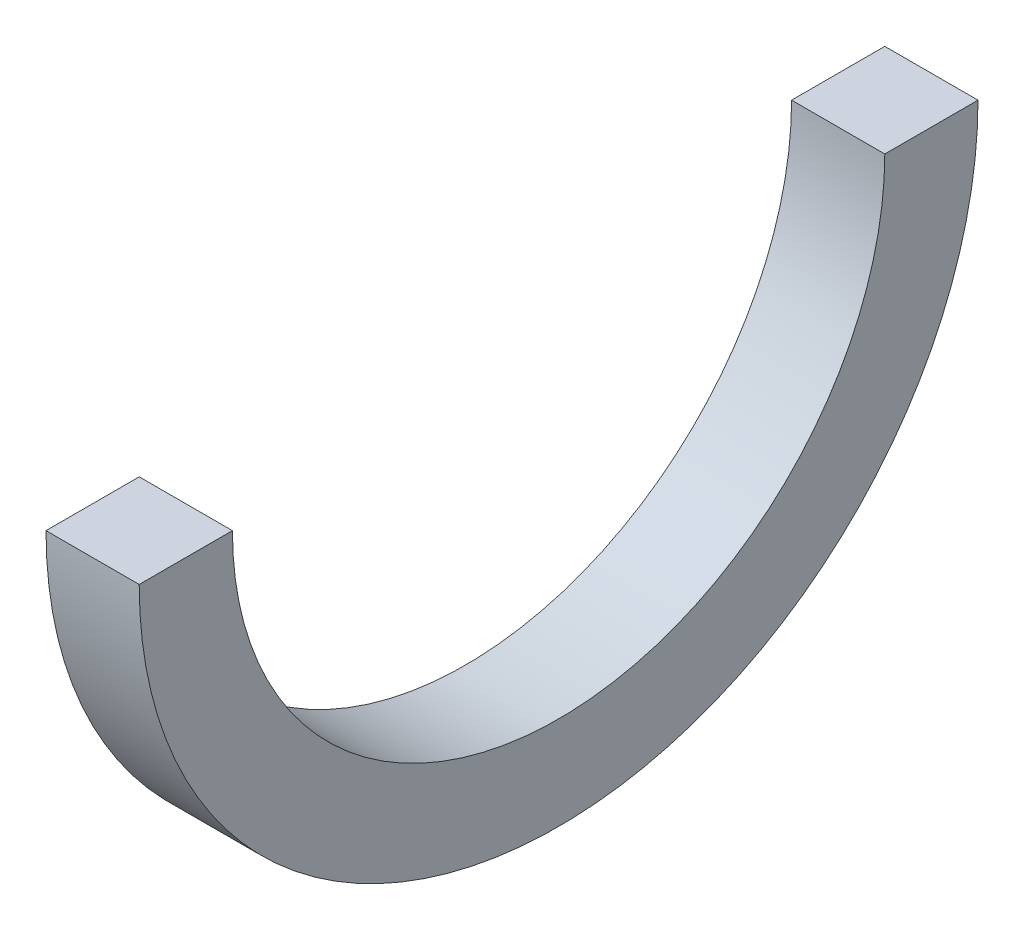
ISO-10303-21;
HEADER;
FILE_DESCRIPTION(('STEP AP214'),'2;1');
FILE_NAME('part.step','',(''),(''),'','','');
FILE_SCHEMA(('AUTOMOTIVE_DESIGN { 1 0 10303 214 1 1 1 1 }'));
ENDSEC;
DATA;
#1=APPLICATION_CONTEXT('core data for automotive mechanical design processes');
#2=APPLICATION_PROTOCOL_DEFINITION('international standard','automotive_design',2000,#1);
#3=PRODUCT_CONTEXT('',#1,'mechanical');
#4=PRODUCT('Part','Part','',(#3));
#5=PRODUCT_RELATED_PRODUCT_CATEGORY('part','',(#4));
#6=PRODUCT_DEFINITION_FORMATION('','',#4);
#7=PRODUCT_DEFINITION_CONTEXT('part definition',#1,'design');
#8=PRODUCT_DEFINITION('design','',#6,#7);
#9=PRODUCT_DEFINITION_SHAPE('','',#8);
#10=(LENGTH_UNIT() NAMED_UNIT(*) SI_UNIT(.MILLI.,.METRE.));
#11=(NAMED_UNIT(*) PLANE_ANGLE_UNIT() SI_UNIT($,.RADIAN.));
#12=(NAMED_UNIT(*) SI_UNIT($,.STERADIAN.) SOLID_ANGLE_UNIT());
#13=UNCERTAINTY_MEASURE_WITH_UNIT(LENGTH_MEASURE(1.E-05),#10,'distance_accuracy_value','');
#14=(GEOMETRIC_REPRESENTATION_CONTEXT(3) GLOBAL_UNCERTAINTY_ASSIGNED_CONTEXT((#13)) GLOBAL_UNIT_ASSIGNED_CONTEXT((#10,
#11,#12)) REPRESENTATION_CONTEXT('',''));
#15=CARTESIAN_POINT('',(0.,0.,0.));
#16=DIRECTION('',(0.,0.,1.));
#17=DIRECTION('',(1.,0.,0.));
#18=AXIS2_PLACEMENT_3D('',#15,#16,#17);
#19=CARTESIAN_POINT('',(2.5,0.,0.));
#20=DIRECTION('',(-1.,0.,0.));
#21=DIRECTION('',(0.,0.,1.));
#22=AXIS2_PLACEMENT_3D('',#19,#20,#21);
#23=CYLINDRICAL_SURFACE('',#22,17.5);
#24=CARTESIAN_POINT('',(-2.5,0.,0.));
#25=DIRECTION('',(-1.,0.,0.));
#26=DIRECTION('',(0.,0.,-1.));
#27=AXIS2_PLACEMENT_3D('',#24,#25,#26);
#28=CIRCLE('',#27,17.5);
#29=CARTESIAN_POINT('',(-2.5,0.,-17.5));
#30=VERTEX_POINT('',#29);
#31=CARTESIAN_POINT('',(-2.5,-1.2220184685951E-13,17.5));
#32=VERTEX_POINT('',#31);
#33=EDGE_CURVE('E107',#30,#32,#28,.T.);
#34=ORIENTED_EDGE('',*,*,#33,.T.);
#35=DIRECTION('',(-1.,0.,0.));
#36=VECTOR('',#35,1.);
#37=CARTESIAN_POINT('',(2.5,-1.2220184685951E-13,17.5));
#38=LINE('',#37,#36);
#39=CARTESIAN_POINT('',(2.5,-1.2220184685951E-13,17.5));
#40=VERTEX_POINT('',#39);
#41=EDGE_CURVE('E11',#40,#32,#38,.T.);
#42=ORIENTED_EDGE('',*,*,#41,.F.);
#43=CARTESIAN_POINT('',(2.5,0.,0.));
#44=DIRECTION('',(-1.,0.,0.));
#45=DIRECTION('',(0.,0.,-1.));
#46=AXIS2_PLACEMENT_3D('',#43,#44,#45);
#47=CIRCLE('',#46,17.5);
#48=CARTESIAN_POINT('',(2.5,0.,-17.5));
#49=VERTEX_POINT('',#48);
#50=EDGE_CURVE('E91',#49,#40,#47,.T.);
#51=ORIENTED_EDGE('',*,*,#50,.F.);
#52=DIRECTION('',(-1.,0.,0.));
#53=VECTOR('',#52,1.);
#54=CARTESIAN_POINT('',(2.5,0.,-17.5));
#55=LINE('',#54,#53);
#56=EDGE_CURVE('E103',#49,#30,#55,.T.);
#57=ORIENTED_EDGE('',*,*,#56,.T.);
#58=EDGE_LOOP('',(#34,#42,#51,#57));
#59=FACE_BOUND('',#58,.T.);
#60=ADVANCED_FACE('F39',(#59),#23,.F.);
#61=CARTESIAN_POINT('',(2.5,-1.57116660247941E-13,22.5));
#62=DIRECTION('',(0.,-1.,0.));
#63=DIRECTION('',(0.,0.,-1.));
#64=AXIS2_PLACEMENT_3D('',#61,#62,#63);
#65=PLANE('',#64);
#66=DIRECTION('',(0.,0.,1.));
#67=VECTOR('',#66,1.);
#68=CARTESIAN_POINT('',(-2.5,-1.57116660247941E-13,22.5));
#69=LINE('',#68,#67);
#70=CARTESIAN_POINT('',(-2.5,-1.57116660247941E-13,22.5));
#71=VERTEX_POINT('',#70);
#72=EDGE_CURVE('E96',#32,#71,#69,.T.);
#73=ORIENTED_EDGE('',*,*,#72,.T.);
#74=DIRECTION('',(-1.,0.,0.));
#75=VECTOR('',#74,1.);
#76=CARTESIAN_POINT('',(2.5,-1.57116660247941E-13,22.5));
#77=LINE('',#76,#75);
#78=CARTESIAN_POINT('',(2.5,-1.57116660247941E-13,22.5));
#79=VERTEX_POINT('',#78);
#80=EDGE_CURVE('E48',#79,#71,#77,.T.);
#81=ORIENTED_EDGE('',*,*,#80,.F.);
#82=DIRECTION('',(0.,0.,1.));
#83=VECTOR('',#82,1.);
#84=CARTESIAN_POINT('',(2.5,-1.57116660247941E-13,22.5));
#85=LINE('',#84,#83);
#86=EDGE_CURVE('E86',#40,#79,#85,.T.);
#87=ORIENTED_EDGE('',*,*,#86,.F.);
#88=ORIENTED_EDGE('',*,*,#41,.T.);
#89=EDGE_LOOP('',(#73,#81,#87,#88));
#90=FACE_BOUND('',#89,.T.);
#91=ADVANCED_FACE('F95',(#90),#65,.F.);
#92=CARTESIAN_POINT('',(2.5,0.,0.));
#93=DIRECTION('',(-1.,0.,0.));
#94=DIRECTION('',(0.,0.,1.));
#95=AXIS2_PLACEMENT_3D('',#92,#93,#94);
#96=CYLINDRICAL_SURFACE('',#95,22.5);
#97=CARTESIAN_POINT('',(-2.5,0.,0.));
#98=DIRECTION('',(1.,0.,0.));
#99=DIRECTION('',(0.,0.,-1.));
#100=AXIS2_PLACEMENT_3D('',#97,#98,#99);
#101=CIRCLE('',#100,22.5);
#102=CARTESIAN_POINT('',(-2.5,0.,-22.5));
#103=VERTEX_POINT('',#102);
#104=EDGE_CURVE('E73',#71,#103,#101,.T.);
#105=ORIENTED_EDGE('',*,*,#104,.T.);
#106=DIRECTION('',(-1.,0.,0.));
#107=VECTOR('',#106,1.);
#108=CARTESIAN_POINT('',(2.5,0.,-22.5));
#109=LINE('',#108,#107);
#110=CARTESIAN_POINT('',(2.5,0.,-22.5));
#111=VERTEX_POINT('',#110);
#112=EDGE_CURVE('E98',#111,#103,#109,.T.);
#113=ORIENTED_EDGE('',*,*,#112,.F.);
#114=CARTESIAN_POINT('',(2.5,0.,0.));
#115=DIRECTION('',(1.,0.,0.));
#116=DIRECTION('',(0.,0.,-1.));
#117=AXIS2_PLACEMENT_3D('',#114,#115,#116);
#118=CIRCLE('',#117,22.5);
#119=EDGE_CURVE('E89',#79,#111,#118,.T.);
#120=ORIENTED_EDGE('',*,*,#119,.F.);
#121=ORIENTED_EDGE('',*,*,#80,.T.);
#122=EDGE_LOOP('',(#105,#113,#120,#121));
#123=FACE_BOUND('',#122,.T.);
#124=ADVANCED_FACE('F99',(#123),#96,.T.);
#125=CARTESIAN_POINT('',(2.5,0.,-17.5));
#126=DIRECTION('',(0.,-1.,0.));
#127=DIRECTION('',(0.,0.,-1.));
#128=AXIS2_PLACEMENT_3D('',#125,#126,#127);
#129=PLANE('',#128);
#130=DIRECTION('',(0.,0.,1.));
#131=VECTOR('',#130,1.);
#132=CARTESIAN_POINT('',(-2.5,0.,-17.5));
#133=LINE('',#132,#131);
#134=EDGE_CURVE('E79',#103,#30,#133,.T.);
#135=ORIENTED_EDGE('',*,*,#134,.T.);
#136=ORIENTED_EDGE('',*,*,#56,.F.);
#137=DIRECTION('',(0.,0.,1.));
#138=VECTOR('',#137,1.);
#139=CARTESIAN_POINT('',(2.5,0.,-17.5));
#140=LINE('',#139,#138);
#141=EDGE_CURVE('E56',#111,#49,#140,.T.);
#142=ORIENTED_EDGE('',*,*,#141,.F.);
#143=ORIENTED_EDGE('',*,*,#112,.T.);
#144=EDGE_LOOP('',(#135,#136,#142,#143));
#145=FACE_BOUND('',#144,.T.);
#146=ADVANCED_FACE('F120',(#145),#129,.F.);
#147=CARTESIAN_POINT('',(2.5,0.,0.));
#148=DIRECTION('',(1.,0.,0.));
#149=DIRECTION('',(0.,0.,-1.));
#150=AXIS2_PLACEMENT_3D('',#147,#148,#149);
#151=PLANE('',#150);
#152=ORIENTED_EDGE('',*,*,#50,.T.);
#153=ORIENTED_EDGE('',*,*,#86,.T.);
#154=ORIENTED_EDGE('',*,*,#119,.T.);
#155=ORIENTED_EDGE('',*,*,#141,.T.);
#156=EDGE_LOOP('',(#152,#153,#154,#155));
#157=FACE_BOUND('',#156,.T.);
#158=ADVANCED_FACE('F87',(#157),#151,.T.);
#159=CARTESIAN_POINT('',(-2.5,0.,0.));
#160=DIRECTION('',(1.,0.,0.));
#161=DIRECTION('',(0.,0.,-1.));
#162=AXIS2_PLACEMENT_3D('',#159,#160,#161);
#163=PLANE('',#162);
#164=ORIENTED_EDGE('',*,*,#33,.F.);
#165=ORIENTED_EDGE('',*,*,#134,.F.);
#166=ORIENTED_EDGE('',*,*,#104,.F.);
#167=ORIENTED_EDGE('',*,*,#72,.F.);
#168=EDGE_LOOP('',(#164,#165,#166,#167));
#169=FACE_BOUND('',#168,.T.);
#170=ADVANCED_FACE('F123',(#169),#163,.F.);
#171=CLOSED_SHELL('',(#60,#91,#124,#146,#158,#170));
#172=MANIFOLD_SOLID_BREP('B2',#171);
#173=ADVANCED_BREP_SHAPE_REPRESENTATION('',(#18,#172),#14);
#174=SHAPE_DEFINITION_REPRESENTATION(#9,#173);
ENDSEC;
END-ISO-10303-21;
